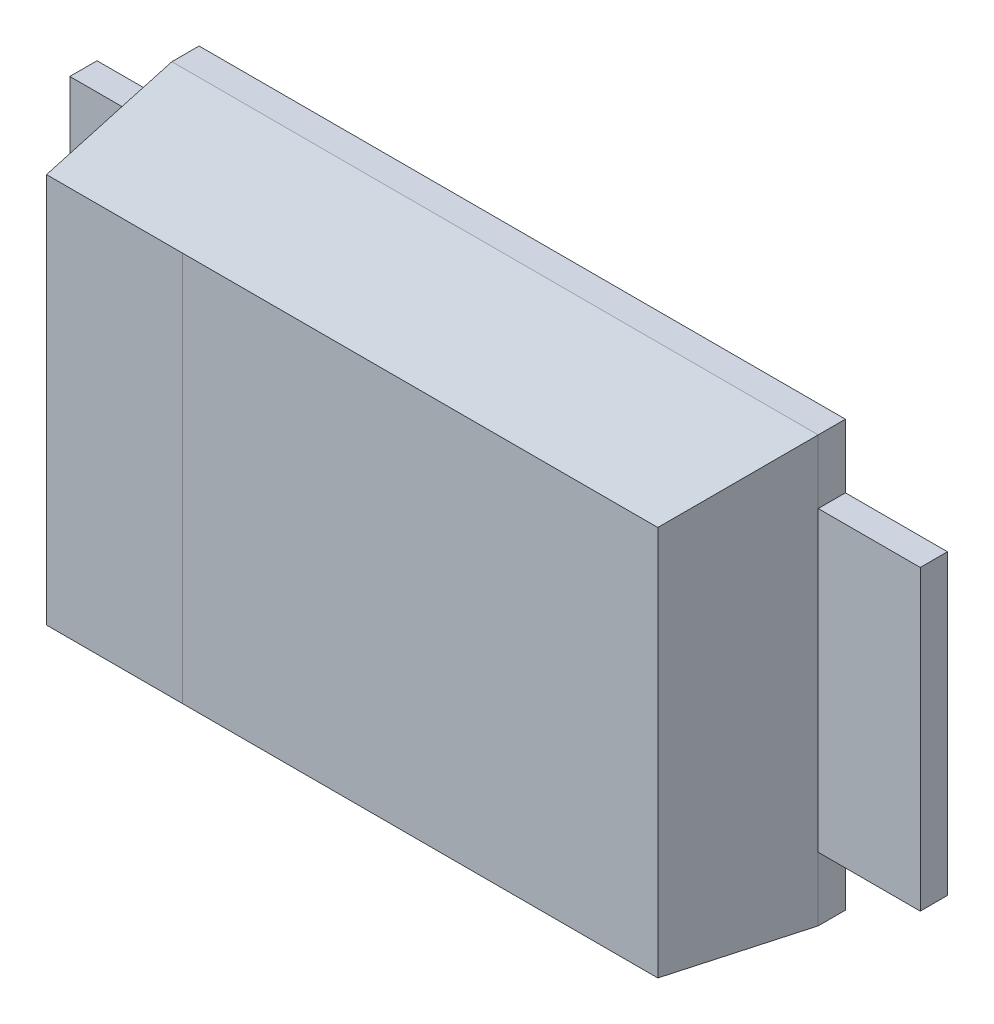
ISO-10303-21;
HEADER;
FILE_DESCRIPTION(('STEP AP214'),'2;1');
FILE_NAME('part.step','',(''),(''),'','','');
FILE_SCHEMA(('AUTOMOTIVE_DESIGN { 1 0 10303 214 1 1 1 1 }'));
ENDSEC;
DATA;
#1=APPLICATION_CONTEXT('core data for automotive mechanical design processes');
#2=APPLICATION_PROTOCOL_DEFINITION('international standard','automotive_design',2000,#1);
#3=PRODUCT_CONTEXT('',#1,'mechanical');
#4=PRODUCT('Part','Part','',(#3));
#5=PRODUCT_RELATED_PRODUCT_CATEGORY('part','',(#4));
#6=PRODUCT_DEFINITION_FORMATION('','',#4);
#7=PRODUCT_DEFINITION_CONTEXT('part definition',#1,'design');
#8=PRODUCT_DEFINITION('design','',#6,#7);
#9=PRODUCT_DEFINITION_SHAPE('','',#8);
#10=(LENGTH_UNIT() NAMED_UNIT(*) SI_UNIT(.MILLI.,.METRE.));
#11=(NAMED_UNIT(*) PLANE_ANGLE_UNIT() SI_UNIT($,.RADIAN.));
#12=(NAMED_UNIT(*) SI_UNIT($,.STERADIAN.) SOLID_ANGLE_UNIT());
#13=UNCERTAINTY_MEASURE_WITH_UNIT(LENGTH_MEASURE(1.E-05),#10,'distance_accuracy_value','');
#14=(GEOMETRIC_REPRESENTATION_CONTEXT(3) GLOBAL_UNCERTAINTY_ASSIGNED_CONTEXT((#13)) GLOBAL_UNIT_ASSIGNED_CONTEXT((#10,
#11,#12)) REPRESENTATION_CONTEXT('',''));
#15=CARTESIAN_POINT('',(0.,0.,0.));
#16=DIRECTION('',(0.,0.,1.));
#17=DIRECTION('',(1.,0.,0.));
#18=AXIS2_PLACEMENT_3D('',#15,#16,#17);
#19=CARTESIAN_POINT('',(0.,0.,1.));
#20=DIRECTION('',(0.,0.,1.));
#21=DIRECTION('',(1.,0.,0.));
#22=AXIS2_PLACEMENT_3D('',#19,#20,#21);
#23=PLANE('',#22);
#24=DIRECTION('',(-1.,0.,0.));
#25=VECTOR('',#24,1.);
#26=CARTESIAN_POINT('',(-1.9,-1.14686096884156,1.));
#27=LINE('',#26,#25);
#28=CARTESIAN_POINT('',(-1.79686096884156,-1.14686096884156,1.));
#29=VERTEX_POINT('',#28);
#30=CARTESIAN_POINT('',(-0.99686096884156,-1.14686096884156,1.));
#31=VERTEX_POINT('',#30);
#32=EDGE_CURVE('E202',#29,#31,#27,.F.);
#33=ORIENTED_EDGE('',*,*,#32,.T.);
#34=DIRECTION('',(0.,1.,0.));
#35=VECTOR('',#34,1.);
#36=CARTESIAN_POINT('',(-0.99686096884156,0.,1.));
#37=LINE('',#36,#35);
#38=CARTESIAN_POINT('',(-0.99686096884156,1.14686096884156,1.));
#39=VERTEX_POINT('',#38);
#40=EDGE_CURVE('E11',#31,#39,#37,.T.);
#41=ORIENTED_EDGE('',*,*,#40,.T.);
#42=DIRECTION('',(1.,0.,0.));
#43=VECTOR('',#42,1.);
#44=CARTESIAN_POINT('',(1.9,1.14686096884156,1.));
#45=LINE('',#44,#43);
#46=CARTESIAN_POINT('',(-1.79686096884156,1.14686096884156,1.));
#47=VERTEX_POINT('',#46);
#48=EDGE_CURVE('E206',#39,#47,#45,.F.);
#49=ORIENTED_EDGE('',*,*,#48,.T.);
#50=DIRECTION('',(0.,1.,0.));
#51=VECTOR('',#50,1.);
#52=CARTESIAN_POINT('',(-1.79686096884156,1.25,1.));
#53=LINE('',#52,#51);
#54=EDGE_CURVE('E197',#47,#29,#53,.F.);
#55=ORIENTED_EDGE('',*,*,#54,.T.);
#56=EDGE_LOOP('',(#33,#41,#49,#55));
#57=FACE_BOUND('',#56,.T.);
#58=ADVANCED_FACE('F39',(#57),#23,.T.);
#59=CARTESIAN_POINT('',(1.9,1.25,0.16));
#60=DIRECTION('',(-1.,0.,0.));
#61=DIRECTION('',(0.,0.,1.));
#62=AXIS2_PLACEMENT_3D('',#59,#60,#61);
#63=PLANE('',#62);
#64=DIRECTION('',(0.,0.,-1.));
#65=VECTOR('',#64,1.);
#66=CARTESIAN_POINT('',(1.9,-0.874999999999999,0.16));
#67=LINE('',#66,#65);
#68=CARTESIAN_POINT('',(1.9,-0.874999999999999,0.16));
#69=VERTEX_POINT('',#68);
#70=CARTESIAN_POINT('',(1.9,-0.874999999999999,0.));
#71=VERTEX_POINT('',#70);
#72=EDGE_CURVE('E185',#69,#71,#67,.T.);
#73=ORIENTED_EDGE('',*,*,#72,.F.);
#74=DIRECTION('',(0.,1.,0.));
#75=VECTOR('',#74,1.);
#76=CARTESIAN_POINT('',(1.9,1.25,0.16));
#77=LINE('',#76,#75);
#78=CARTESIAN_POINT('',(1.9,-1.25,0.16));
#79=VERTEX_POINT('',#78);
#80=EDGE_CURVE('E210',#79,#69,#77,.T.);
#81=ORIENTED_EDGE('',*,*,#80,.F.);
#82=DIRECTION('',(0.,0.,-1.));
#83=VECTOR('',#82,1.);
#84=CARTESIAN_POINT('',(1.9,-1.25,0.16));
#85=LINE('',#84,#83);
#86=CARTESIAN_POINT('',(1.9,-1.25,0.));
#87=VERTEX_POINT('',#86);
#88=EDGE_CURVE('E225',#79,#87,#85,.T.);
#89=ORIENTED_EDGE('',*,*,#88,.T.);
#90=DIRECTION('',(0.,1.,0.));
#91=VECTOR('',#90,1.);
#92=CARTESIAN_POINT('',(1.9,1.25,0.));
#93=LINE('',#92,#91);
#94=EDGE_CURVE('E226',#87,#71,#93,.T.);
#95=ORIENTED_EDGE('',*,*,#94,.T.);
#96=EDGE_LOOP('',(#73,#81,#89,#95));
#97=FACE_BOUND('',#96,.T.);
#98=ADVANCED_FACE('F41',(#97),#63,.F.);
#99=DIRECTION('',(0.,0.,1.));
#100=VECTOR('',#99,1.);
#101=CARTESIAN_POINT('',(1.9,0.875000000000001,0.16));
#102=LINE('',#101,#100);
#103=CARTESIAN_POINT('',(1.9,0.875000000000001,0.));
#104=VERTEX_POINT('',#103);
#105=CARTESIAN_POINT('',(1.9,0.875000000000001,0.16));
#106=VERTEX_POINT('',#105);
#107=EDGE_CURVE('E181',#104,#106,#102,.T.);
#108=ORIENTED_EDGE('',*,*,#107,.F.);
#109=CARTESIAN_POINT('',(1.9,1.25,0.));
#110=VERTEX_POINT('',#109);
#111=EDGE_CURVE('E191',#104,#110,#93,.T.);
#112=ORIENTED_EDGE('',*,*,#111,.T.);
#113=DIRECTION('',(0.,0.,-1.));
#114=VECTOR('',#113,1.);
#115=CARTESIAN_POINT('',(1.9,1.25,0.16));
#116=LINE('',#115,#114);
#117=CARTESIAN_POINT('',(1.9,1.25,0.16));
#118=VERTEX_POINT('',#117);
#119=EDGE_CURVE('E48',#118,#110,#116,.T.);
#120=ORIENTED_EDGE('',*,*,#119,.F.);
#121=EDGE_CURVE('E214',#106,#118,#77,.T.);
#122=ORIENTED_EDGE('',*,*,#121,.F.);
#123=EDGE_LOOP('',(#108,#112,#120,#122));
#124=FACE_BOUND('',#123,.T.);
#125=ADVANCED_FACE('F253',(#124),#63,.F.);
#126=CARTESIAN_POINT('',(-1.9,1.25,0.16));
#127=DIRECTION('',(1.,0.,0.));
#128=DIRECTION('',(0.,1.,0.));
#129=AXIS2_PLACEMENT_3D('',#126,#127,#128);
#130=PLANE('',#129);
#131=DIRECTION('',(0.,0.,1.));
#132=VECTOR('',#131,1.);
#133=CARTESIAN_POINT('',(-1.9,-0.874999999999999,0.16));
#134=LINE('',#133,#132);
#135=CARTESIAN_POINT('',(-1.9,-0.875,0.));
#136=VERTEX_POINT('',#135);
#137=CARTESIAN_POINT('',(-1.9,-0.875,0.16));
#138=VERTEX_POINT('',#137);
#139=EDGE_CURVE('E151',#136,#138,#134,.T.);
#140=ORIENTED_EDGE('',*,*,#139,.F.);
#141=DIRECTION('',(0.,-1.,0.));
#142=VECTOR('',#141,1.);
#143=CARTESIAN_POINT('',(-1.9,1.25,0.));
#144=LINE('',#143,#142);
#145=CARTESIAN_POINT('',(-1.9,-1.25,0.));
#146=VERTEX_POINT('',#145);
#147=EDGE_CURVE('E231',#136,#146,#144,.T.);
#148=ORIENTED_EDGE('',*,*,#147,.T.);
#149=DIRECTION('',(0.,0.,-1.));
#150=VECTOR('',#149,1.);
#151=CARTESIAN_POINT('',(-1.9,-1.25,0.16));
#152=LINE('',#151,#150);
#153=CARTESIAN_POINT('',(-1.9,-1.25,0.16));
#154=VERTEX_POINT('',#153);
#155=EDGE_CURVE('E239',#154,#146,#152,.T.);
#156=ORIENTED_EDGE('',*,*,#155,.F.);
#157=DIRECTION('',(0.,-1.,0.));
#158=VECTOR('',#157,1.);
#159=CARTESIAN_POINT('',(-1.9,1.25,0.16));
#160=LINE('',#159,#158);
#161=EDGE_CURVE('E217',#138,#154,#160,.T.);
#162=ORIENTED_EDGE('',*,*,#161,.F.);
#163=EDGE_LOOP('',(#140,#148,#156,#162));
#164=FACE_BOUND('',#163,.T.);
#165=ADVANCED_FACE('F321',(#164),#130,.F.);
#166=DIRECTION('',(0.,0.,-1.));
#167=VECTOR('',#166,1.);
#168=CARTESIAN_POINT('',(-1.9,0.875,0.16));
#169=LINE('',#168,#167);
#170=CARTESIAN_POINT('',(-1.9,0.875,0.16));
#171=VERTEX_POINT('',#170);
#172=CARTESIAN_POINT('',(-1.9,0.875,0.));
#173=VERTEX_POINT('',#172);
#174=EDGE_CURVE('E173',#171,#173,#169,.T.);
#175=ORIENTED_EDGE('',*,*,#174,.F.);
#176=CARTESIAN_POINT('',(-1.9,1.25,0.16));
#177=VERTEX_POINT('',#176);
#178=EDGE_CURVE('E218',#177,#171,#160,.T.);
#179=ORIENTED_EDGE('',*,*,#178,.F.);
#180=DIRECTION('',(0.,0.,-1.));
#181=VECTOR('',#180,1.);
#182=CARTESIAN_POINT('',(-1.9,1.25,0.16));
#183=LINE('',#182,#181);
#184=CARTESIAN_POINT('',(-1.9,1.25,0.));
#185=VERTEX_POINT('',#184);
#186=EDGE_CURVE('E242',#177,#185,#183,.T.);
#187=ORIENTED_EDGE('',*,*,#186,.T.);
#188=EDGE_CURVE('E232',#185,#173,#144,.T.);
#189=ORIENTED_EDGE('',*,*,#188,.T.);
#190=EDGE_LOOP('',(#175,#179,#187,#189));
#191=FACE_BOUND('',#190,.T.);
#192=ADVANCED_FACE('F305',(#191),#130,.F.);
#193=CARTESIAN_POINT('',(-1.9,1.25,0.16));
#194=DIRECTION('',(0.,-1.,0.));
#195=DIRECTION('',(0.,0.,-1.));
#196=AXIS2_PLACEMENT_3D('',#193,#194,#195);
#197=PLANE('',#196);
#198=DIRECTION('',(-1.,0.,0.));
#199=VECTOR('',#198,1.);
#200=CARTESIAN_POINT('',(-1.9,1.25,0.));
#201=LINE('',#200,#199);
#202=EDGE_CURVE('E229',#110,#185,#201,.T.);
#203=ORIENTED_EDGE('',*,*,#202,.T.);
#204=ORIENTED_EDGE('',*,*,#186,.F.);
#205=DIRECTION('',(-1.,0.,0.));
#206=VECTOR('',#205,1.);
#207=CARTESIAN_POINT('',(-1.9,1.25,0.16));
#208=LINE('',#207,#206);
#209=EDGE_CURVE('E213',#118,#177,#208,.T.);
#210=ORIENTED_EDGE('',*,*,#209,.F.);
#211=ORIENTED_EDGE('',*,*,#119,.T.);
#212=EDGE_LOOP('',(#203,#204,#210,#211));
#213=FACE_BOUND('',#212,.T.);
#214=ADVANCED_FACE('F248',(#213),#197,.F.);
#215=CARTESIAN_POINT('',(-1.9,-1.25,0.16));
#216=DIRECTION('',(0.,1.,0.));
#217=DIRECTION('',(0.,0.,1.));
#218=AXIS2_PLACEMENT_3D('',#215,#216,#217);
#219=PLANE('',#218);
#220=DIRECTION('',(1.,0.,0.));
#221=VECTOR('',#220,1.);
#222=CARTESIAN_POINT('',(-1.9,-1.25,0.));
#223=LINE('',#222,#221);
#224=EDGE_CURVE('E235',#146,#87,#223,.T.);
#225=ORIENTED_EDGE('',*,*,#224,.T.);
#226=ORIENTED_EDGE('',*,*,#88,.F.);
#227=DIRECTION('',(1.,0.,0.));
#228=VECTOR('',#227,1.);
#229=CARTESIAN_POINT('',(-1.9,-1.25,0.16));
#230=LINE('',#229,#228);
#231=EDGE_CURVE('E221',#154,#79,#230,.T.);
#232=ORIENTED_EDGE('',*,*,#231,.F.);
#233=ORIENTED_EDGE('',*,*,#155,.T.);
#234=EDGE_LOOP('',(#225,#226,#232,#233));
#235=FACE_BOUND('',#234,.T.);
#236=ADVANCED_FACE('F319',(#235),#219,.F.);
#237=CARTESIAN_POINT('',(0.,0.,0.));
#238=DIRECTION('',(0.,0.,1.));
#239=DIRECTION('',(1.,0.,0.));
#240=AXIS2_PLACEMENT_3D('',#237,#238,#239);
#241=PLANE('',#240);
#242=ORIENTED_EDGE('',*,*,#111,.F.);
#243=DIRECTION('',(-1.,0.,0.));
#244=VECTOR('',#243,1.);
#245=CARTESIAN_POINT('',(2.5,0.875000000000001,0.));
#246=LINE('',#245,#244);
#247=CARTESIAN_POINT('',(2.5,0.875000000000001,0.));
#248=VERTEX_POINT('',#247);
#249=EDGE_CURVE('E165',#248,#104,#246,.T.);
#250=ORIENTED_EDGE('',*,*,#249,.F.);
#251=DIRECTION('',(0.,1.,0.));
#252=VECTOR('',#251,1.);
#253=CARTESIAN_POINT('',(2.5,0.875000000000001,0.));
#254=LINE('',#253,#252);
#255=CARTESIAN_POINT('',(2.5,-0.874999999999999,0.));
#256=VERTEX_POINT('',#255);
#257=EDGE_CURVE('E286',#256,#248,#254,.T.);
#258=ORIENTED_EDGE('',*,*,#257,.F.);
#259=DIRECTION('',(1.,0.,0.));
#260=VECTOR('',#259,1.);
#261=CARTESIAN_POINT('',(2.5,-0.874999999999999,0.));
#262=LINE('',#261,#260);
#263=EDGE_CURVE('E284',#71,#256,#262,.T.);
#264=ORIENTED_EDGE('',*,*,#263,.F.);
#265=ORIENTED_EDGE('',*,*,#94,.F.);
#266=ORIENTED_EDGE('',*,*,#224,.F.);
#267=ORIENTED_EDGE('',*,*,#147,.F.);
#268=CARTESIAN_POINT('',(-2.5,-0.875,0.));
#269=VERTEX_POINT('',#268);
#270=EDGE_CURVE('E287',#269,#136,#262,.T.);
#271=ORIENTED_EDGE('',*,*,#270,.F.);
#272=DIRECTION('',(0.,-1.,0.));
#273=VECTOR('',#272,1.);
#274=CARTESIAN_POINT('',(-2.5,0.875,0.));
#275=LINE('',#274,#273);
#276=CARTESIAN_POINT('',(-2.5,0.875,0.));
#277=VERTEX_POINT('',#276);
#278=EDGE_CURVE('E169',#277,#269,#275,.T.);
#279=ORIENTED_EDGE('',*,*,#278,.F.);
#280=EDGE_CURVE('E293',#173,#277,#246,.T.);
#281=ORIENTED_EDGE('',*,*,#280,.F.);
#282=ORIENTED_EDGE('',*,*,#188,.F.);
#283=ORIENTED_EDGE('',*,*,#202,.F.);
#284=EDGE_LOOP('',(#242,#250,#258,#264,#265,#266,#267,#271,#279,#281,#282,#283));
#285=FACE_BOUND('',#284,.T.);
#286=ADVANCED_FACE('F281',(#285),#241,.F.);
#287=CARTESIAN_POINT('',(-1.9,-1.25,0.16));
#288=DIRECTION('',(0.,-0.992546151641322,0.121869343405148));
#289=DIRECTION('',(0.,-0.121869343405148,-0.992546151641322));
#290=AXIS2_PLACEMENT_3D('',#287,#288,#289);
#291=PLANE('',#290);
#292=ORIENTED_EDGE('',*,*,#231,.T.);
#293=DIRECTION('',(0.120974291151355,-0.120974291151355,-0.985256536015293));
#294=VECTOR('',#293,1.);
#295=CARTESIAN_POINT('',(1.9,-1.25,0.16));
#296=LINE('',#295,#294);
#297=CARTESIAN_POINT('',(1.79686096884156,-1.14686096884156,1.));
#298=VERTEX_POINT('',#297);
#299=EDGE_CURVE('E188',#298,#79,#296,.T.);
#300=ORIENTED_EDGE('',*,*,#299,.F.);
#301=EDGE_CURVE('E187',#31,#298,#27,.F.);
#302=ORIENTED_EDGE('',*,*,#301,.F.);
#303=ORIENTED_EDGE('',*,*,#32,.F.);
#304=DIRECTION('',(-0.120974291151355,-0.120974291151355,-0.985256536015293));
#305=VECTOR('',#304,1.);
#306=CARTESIAN_POINT('',(-1.9,-1.25,0.16));
#307=LINE('',#306,#305);
#308=EDGE_CURVE('E193',#29,#154,#307,.T.);
#309=ORIENTED_EDGE('',*,*,#308,.T.);
#310=EDGE_LOOP('',(#292,#300,#302,#303,#309));
#311=FACE_BOUND('',#310,.T.);
#312=ADVANCED_FACE('F315',(#311),#291,.T.);
#313=CARTESIAN_POINT('',(1.9,-1.25,0.16));
#314=DIRECTION('',(0.992546151641322,0.,0.121869343405148));
#315=DIRECTION('',(0.121869343405148,0.,-0.992546151641322));
#316=AXIS2_PLACEMENT_3D('',#313,#314,#315);
#317=PLANE('',#316);
#318=ORIENTED_EDGE('',*,*,#80,.T.);
#319=DIRECTION('',(0.,1.,0.));
#320=VECTOR('',#319,1.);
#321=CARTESIAN_POINT('',(1.9,-1.25,0.16));
#322=LINE('',#321,#320);
#323=EDGE_CURVE('E170',#106,#69,#322,.F.);
#324=ORIENTED_EDGE('',*,*,#323,.F.);
#325=ORIENTED_EDGE('',*,*,#121,.T.);
#326=DIRECTION('',(0.120974291151355,0.120974291151355,-0.985256536015293));
#327=VECTOR('',#326,1.);
#328=CARTESIAN_POINT('',(1.9,1.25,0.16));
#329=LINE('',#328,#327);
#330=CARTESIAN_POINT('',(1.79686096884156,1.14686096884156,1.));
#331=VERTEX_POINT('',#330);
#332=EDGE_CURVE('E192',#331,#118,#329,.T.);
#333=ORIENTED_EDGE('',*,*,#332,.F.);
#334=DIRECTION('',(0.,-1.,0.));
#335=VECTOR('',#334,1.);
#336=CARTESIAN_POINT('',(1.79686096884156,-1.25,1.));
#337=LINE('',#336,#335);
#338=EDGE_CURVE('E204',#298,#331,#337,.F.);
#339=ORIENTED_EDGE('',*,*,#338,.F.);
#340=ORIENTED_EDGE('',*,*,#299,.T.);
#341=EDGE_LOOP('',(#318,#324,#325,#333,#339,#340));
#342=FACE_BOUND('',#341,.T.);
#343=ADVANCED_FACE('F263',(#342),#317,.T.);
#344=CARTESIAN_POINT('',(1.9,1.25,0.16));
#345=DIRECTION('',(0.,0.992546151641322,0.121869343405148));
#346=DIRECTION('',(0.,-0.121869343405148,0.992546151641322));
#347=AXIS2_PLACEMENT_3D('',#344,#345,#346);
#348=PLANE('',#347);
#349=ORIENTED_EDGE('',*,*,#209,.T.);
#350=DIRECTION('',(-0.120974291151355,0.120974291151355,-0.985256536015293));
#351=VECTOR('',#350,1.);
#352=CARTESIAN_POINT('',(-1.9,1.25,0.16));
#353=LINE('',#352,#351);
#354=EDGE_CURVE('E196',#47,#177,#353,.T.);
#355=ORIENTED_EDGE('',*,*,#354,.F.);
#356=ORIENTED_EDGE('',*,*,#48,.F.);
#357=EDGE_CURVE('E207',#331,#39,#45,.F.);
#358=ORIENTED_EDGE('',*,*,#357,.F.);
#359=ORIENTED_EDGE('',*,*,#332,.T.);
#360=EDGE_LOOP('',(#349,#355,#356,#358,#359));
#361=FACE_BOUND('',#360,.T.);
#362=ADVANCED_FACE('F259',(#361),#348,.T.);
#363=CARTESIAN_POINT('',(-1.9,1.25,0.16));
#364=DIRECTION('',(-0.992546151641322,0.,0.121869343405148));
#365=DIRECTION('',(0.121869343405148,0.,0.992546151641322));
#366=AXIS2_PLACEMENT_3D('',#363,#364,#365);
#367=PLANE('',#366);
#368=ORIENTED_EDGE('',*,*,#178,.T.);
#369=EDGE_CURVE('E222',#171,#138,#160,.T.);
#370=ORIENTED_EDGE('',*,*,#369,.T.);
#371=ORIENTED_EDGE('',*,*,#161,.T.);
#372=ORIENTED_EDGE('',*,*,#308,.F.);
#373=ORIENTED_EDGE('',*,*,#54,.F.);
#374=ORIENTED_EDGE('',*,*,#354,.T.);
#375=EDGE_LOOP('',(#368,#370,#371,#372,#373,#374));
#376=FACE_BOUND('',#375,.T.);
#377=ADVANCED_FACE('F309',(#376),#367,.T.);
#378=ORIENTED_EDGE('',*,*,#40,.F.);
#379=ORIENTED_EDGE('',*,*,#301,.T.);
#380=ORIENTED_EDGE('',*,*,#338,.T.);
#381=ORIENTED_EDGE('',*,*,#357,.T.);
#382=EDGE_LOOP('',(#378,#379,#380,#381));
#383=FACE_BOUND('',#382,.T.);
#384=ADVANCED_FACE('F312',(#383),#23,.T.);
#385=CARTESIAN_POINT('',(-2.5,0.875,0.16));
#386=DIRECTION('',(1.,0.,0.));
#387=DIRECTION('',(0.,0.,-1.));
#388=AXIS2_PLACEMENT_3D('',#385,#386,#387);
#389=PLANE('',#388);
#390=ORIENTED_EDGE('',*,*,#278,.T.);
#391=DIRECTION('',(0.,0.,-1.));
#392=VECTOR('',#391,1.);
#393=CARTESIAN_POINT('',(-2.5,-0.875,0.16));
#394=LINE('',#393,#392);
#395=CARTESIAN_POINT('',(-2.5,-0.875,0.16));
#396=VERTEX_POINT('',#395);
#397=EDGE_CURVE('E148',#396,#269,#394,.T.);
#398=ORIENTED_EDGE('',*,*,#397,.F.);
#399=DIRECTION('',(0.,-1.,0.));
#400=VECTOR('',#399,1.);
#401=CARTESIAN_POINT('',(-2.5,0.875,0.16));
#402=LINE('',#401,#400);
#403=CARTESIAN_POINT('',(-2.5,0.875,0.16));
#404=VERTEX_POINT('',#403);
#405=EDGE_CURVE('E158',#404,#396,#402,.T.);
#406=ORIENTED_EDGE('',*,*,#405,.F.);
#407=DIRECTION('',(0.,0.,-1.));
#408=VECTOR('',#407,1.);
#409=CARTESIAN_POINT('',(-2.5,0.875,0.16));
#410=LINE('',#409,#408);
#411=EDGE_CURVE('E295',#404,#277,#410,.T.);
#412=ORIENTED_EDGE('',*,*,#411,.T.);
#413=EDGE_LOOP('',(#390,#398,#406,#412));
#414=FACE_BOUND('',#413,.T.);
#415=ADVANCED_FACE('F167',(#414),#389,.F.);
#416=CARTESIAN_POINT('',(0.,0.,0.16));
#417=DIRECTION('',(0.,0.,-1.));
#418=DIRECTION('',(-1.,0.,0.));
#419=AXIS2_PLACEMENT_3D('',#416,#417,#418);
#420=PLANE('',#419);
#421=DIRECTION('',(1.,0.,0.));
#422=VECTOR('',#421,1.);
#423=CARTESIAN_POINT('',(2.5,-0.874999999999999,0.16));
#424=LINE('',#423,#422);
#425=EDGE_CURVE('E144',#396,#138,#424,.T.);
#426=ORIENTED_EDGE('',*,*,#425,.T.);
#427=ORIENTED_EDGE('',*,*,#369,.F.);
#428=DIRECTION('',(-1.,0.,0.));
#429=VECTOR('',#428,1.);
#430=CARTESIAN_POINT('',(2.5,0.875000000000001,0.16));
#431=LINE('',#430,#429);
#432=EDGE_CURVE('E161',#171,#404,#431,.T.);
#433=ORIENTED_EDGE('',*,*,#432,.T.);
#434=ORIENTED_EDGE('',*,*,#405,.T.);
#435=EDGE_LOOP('',(#426,#427,#433,#434));
#436=FACE_BOUND('',#435,.T.);
#437=ADVANCED_FACE('F159',(#436),#420,.F.);
#438=CARTESIAN_POINT('',(2.5,0.875000000000001,0.16));
#439=DIRECTION('',(0.,-1.,0.));
#440=DIRECTION('',(1.,0.,0.));
#441=AXIS2_PLACEMENT_3D('',#438,#439,#440);
#442=PLANE('',#441);
#443=ORIENTED_EDGE('',*,*,#432,.F.);
#444=ORIENTED_EDGE('',*,*,#174,.T.);
#445=ORIENTED_EDGE('',*,*,#280,.T.);
#446=ORIENTED_EDGE('',*,*,#411,.F.);
#447=EDGE_LOOP('',(#443,#444,#445,#446));
#448=FACE_BOUND('',#447,.T.);
#449=ADVANCED_FACE('F399',(#448),#442,.F.);
#450=CARTESIAN_POINT('',(2.5,-0.874999999999999,0.16));
#451=DIRECTION('',(0.,1.,0.));
#452=DIRECTION('',(-1.,0.,0.));
#453=AXIS2_PLACEMENT_3D('',#450,#451,#452);
#454=PLANE('',#453);
#455=ORIENTED_EDGE('',*,*,#270,.T.);
#456=ORIENTED_EDGE('',*,*,#139,.T.);
#457=ORIENTED_EDGE('',*,*,#425,.F.);
#458=ORIENTED_EDGE('',*,*,#397,.T.);
#459=EDGE_LOOP('',(#455,#456,#457,#458));
#460=FACE_BOUND('',#459,.T.);
#461=ADVANCED_FACE('F146',(#460),#454,.F.);
#462=CARTESIAN_POINT('',(2.5,-0.874999999999999,0.16));
#463=VERTEX_POINT('',#462);
#464=EDGE_CURVE('E155',#69,#463,#424,.T.);
#465=ORIENTED_EDGE('',*,*,#464,.F.);
#466=ORIENTED_EDGE('',*,*,#72,.T.);
#467=ORIENTED_EDGE('',*,*,#263,.T.);
#468=DIRECTION('',(0.,0.,-1.));
#469=VECTOR('',#468,1.);
#470=CARTESIAN_POINT('',(2.5,-0.874999999999999,0.16));
#471=LINE('',#470,#469);
#472=EDGE_CURVE('E171',#463,#256,#471,.T.);
#473=ORIENTED_EDGE('',*,*,#472,.F.);
#474=EDGE_LOOP('',(#465,#466,#467,#473));
#475=FACE_BOUND('',#474,.T.);
#476=ADVANCED_FACE('F273',(#475),#454,.F.);
#477=ORIENTED_EDGE('',*,*,#249,.T.);
#478=ORIENTED_EDGE('',*,*,#107,.T.);
#479=CARTESIAN_POINT('',(2.5,0.875000000000001,0.16));
#480=VERTEX_POINT('',#479);
#481=EDGE_CURVE('E270',#480,#106,#431,.T.);
#482=ORIENTED_EDGE('',*,*,#481,.F.);
#483=DIRECTION('',(0.,0.,-1.));
#484=VECTOR('',#483,1.);
#485=CARTESIAN_POINT('',(2.5,0.875000000000001,0.16));
#486=LINE('',#485,#484);
#487=EDGE_CURVE('E176',#480,#248,#486,.T.);
#488=ORIENTED_EDGE('',*,*,#487,.T.);
#489=EDGE_LOOP('',(#477,#478,#482,#488));
#490=FACE_BOUND('',#489,.T.);
#491=ADVANCED_FACE('F299',(#490),#442,.F.);
#492=ORIENTED_EDGE('',*,*,#481,.T.);
#493=ORIENTED_EDGE('',*,*,#323,.T.);
#494=ORIENTED_EDGE('',*,*,#464,.T.);
#495=DIRECTION('',(0.,1.,0.));
#496=VECTOR('',#495,1.);
#497=CARTESIAN_POINT('',(2.5,0.875000000000001,0.16));
#498=LINE('',#497,#496);
#499=EDGE_CURVE('E154',#463,#480,#498,.T.);
#500=ORIENTED_EDGE('',*,*,#499,.T.);
#501=EDGE_LOOP('',(#492,#493,#494,#500));
#502=FACE_BOUND('',#501,.T.);
#503=ADVANCED_FACE('F267',(#502),#420,.F.);
#504=CARTESIAN_POINT('',(2.5,0.875000000000001,0.16));
#505=DIRECTION('',(-1.,0.,0.));
#506=DIRECTION('',(0.,0.,1.));
#507=AXIS2_PLACEMENT_3D('',#504,#505,#506);
#508=PLANE('',#507);
#509=ORIENTED_EDGE('',*,*,#257,.T.);
#510=ORIENTED_EDGE('',*,*,#487,.F.);
#511=ORIENTED_EDGE('',*,*,#499,.F.);
#512=ORIENTED_EDGE('',*,*,#472,.T.);
#513=EDGE_LOOP('',(#509,#510,#511,#512));
#514=FACE_BOUND('',#513,.T.);
#515=ADVANCED_FACE('F439',(#514),#508,.F.);
#516=CLOSED_SHELL('',(#58,#98,#125,#165,#192,#214,#236,#286,#312,#343,#362,#377,#384,#415,#437,
#449,#461,#476,#491,#503,#515));
#517=MANIFOLD_SOLID_BREP('B2',#516);
#518=ADVANCED_BREP_SHAPE_REPRESENTATION('',(#18,#517),#14);
#519=SHAPE_DEFINITION_REPRESENTATION(#9,#518);
ENDSEC;
END-ISO-10303-21;
